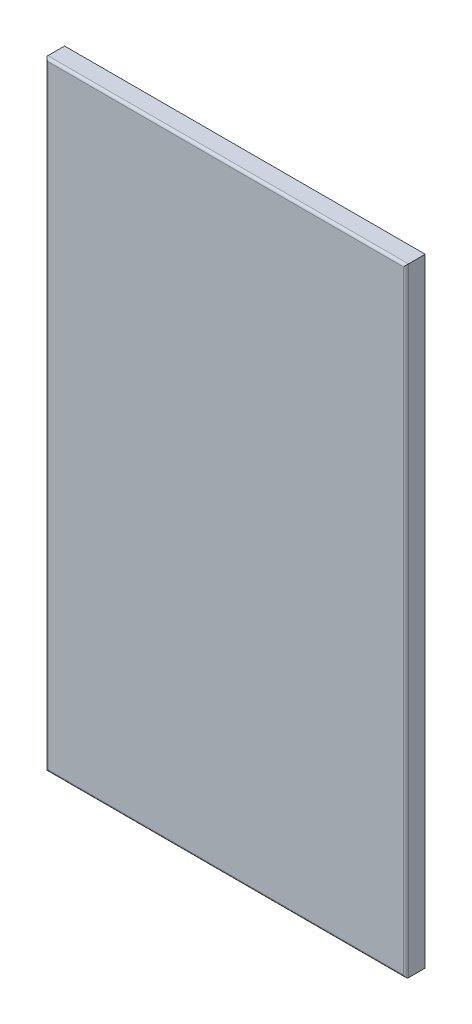
ISO-10303-21;
HEADER;
FILE_DESCRIPTION(('STEP AP214'),'2;1');
FILE_NAME('part.step','',(''),(''),'','','');
FILE_SCHEMA(('AUTOMOTIVE_DESIGN { 1 0 10303 214 1 1 1 1 }'));
ENDSEC;
DATA;
#1=APPLICATION_CONTEXT('core data for automotive mechanical design processes');
#2=APPLICATION_PROTOCOL_DEFINITION('international standard','automotive_design',2000,#1);
#3=PRODUCT_CONTEXT('',#1,'mechanical');
#4=PRODUCT('Part','Part','',(#3));
#5=PRODUCT_RELATED_PRODUCT_CATEGORY('part','',(#4));
#6=PRODUCT_DEFINITION_FORMATION('','',#4);
#7=PRODUCT_DEFINITION_CONTEXT('part definition',#1,'design');
#8=PRODUCT_DEFINITION('design','',#6,#7);
#9=PRODUCT_DEFINITION_SHAPE('','',#8);
#10=(LENGTH_UNIT() NAMED_UNIT(*) SI_UNIT(.MILLI.,.METRE.));
#11=(NAMED_UNIT(*) PLANE_ANGLE_UNIT() SI_UNIT($,.RADIAN.));
#12=(NAMED_UNIT(*) SI_UNIT($,.STERADIAN.) SOLID_ANGLE_UNIT());
#13=UNCERTAINTY_MEASURE_WITH_UNIT(LENGTH_MEASURE(1.E-05),#10,'distance_accuracy_value','');
#14=(GEOMETRIC_REPRESENTATION_CONTEXT(3) GLOBAL_UNCERTAINTY_ASSIGNED_CONTEXT((#13)) GLOBAL_UNIT_ASSIGNED_CONTEXT((#10,
#11,#12)) REPRESENTATION_CONTEXT('',''));
#15=CARTESIAN_POINT('',(0.,0.,0.));
#16=DIRECTION('',(0.,0.,1.));
#17=DIRECTION('',(1.,0.,0.));
#18=AXIS2_PLACEMENT_3D('',#15,#16,#17);
#19=CARTESIAN_POINT('',(-177.8,304.8,2.54));
#20=DIRECTION('',(1.,0.,0.));
#21=DIRECTION('',(0.,1.,0.));
#22=AXIS2_PLACEMENT_3D('',#19,#20,#21);
#23=PLANE('',#22);
#24=DIRECTION('',(0.,0.,-1.));
#25=VECTOR('',#24,1.);
#26=CARTESIAN_POINT('',(-177.8,-304.8,2.54));
#27=LINE('',#26,#25);
#28=CARTESIAN_POINT('',(-177.8,-304.8,0.));
#29=VERTEX_POINT('',#28);
#30=CARTESIAN_POINT('',(-177.8,-304.8,-16.51));
#31=VERTEX_POINT('',#30);
#32=EDGE_CURVE('E167',#29,#31,#27,.T.);
#33=ORIENTED_EDGE('',*,*,#32,.F.);
#34=DIRECTION('',(0.,-1.,0.));
#35=VECTOR('',#34,1.);
#36=CARTESIAN_POINT('',(-177.8,304.8,0.));
#37=LINE('',#36,#35);
#38=CARTESIAN_POINT('',(-177.8,304.8,0.));
#39=VERTEX_POINT('',#38);
#40=EDGE_CURVE('E11',#29,#39,#37,.F.);
#41=ORIENTED_EDGE('',*,*,#40,.T.);
#42=DIRECTION('',(0.,0.,-1.));
#43=VECTOR('',#42,1.);
#44=CARTESIAN_POINT('',(-177.8,304.8,2.54));
#45=LINE('',#44,#43);
#46=CARTESIAN_POINT('',(-177.8,304.8,-16.51));
#47=VERTEX_POINT('',#46);
#48=EDGE_CURVE('E161',#39,#47,#45,.T.);
#49=ORIENTED_EDGE('',*,*,#48,.T.);
#50=DIRECTION('',(0.,-1.,0.));
#51=VECTOR('',#50,1.);
#52=CARTESIAN_POINT('',(-177.8,304.8,-16.51));
#53=LINE('',#52,#51);
#54=EDGE_CURVE('E152',#47,#31,#53,.T.);
#55=ORIENTED_EDGE('',*,*,#54,.T.);
#56=EDGE_LOOP('',(#33,#41,#49,#55));
#57=FACE_BOUND('',#56,.T.);
#58=ADVANCED_FACE('F33',(#57),#23,.F.);
#59=CARTESIAN_POINT('',(177.8,-304.8,2.54));
#60=DIRECTION('',(0.,1.,0.));
#61=DIRECTION('',(0.,0.,1.));
#62=AXIS2_PLACEMENT_3D('',#59,#60,#61);
#63=PLANE('',#62);
#64=DIRECTION('',(0.,0.,-1.));
#65=VECTOR('',#64,1.);
#66=CARTESIAN_POINT('',(177.8,-304.8,2.54));
#67=LINE('',#66,#65);
#68=CARTESIAN_POINT('',(177.8,-304.8,0.));
#69=VERTEX_POINT('',#68);
#70=CARTESIAN_POINT('',(177.8,-304.8,-16.51));
#71=VERTEX_POINT('',#70);
#72=EDGE_CURVE('E165',#69,#71,#67,.T.);
#73=ORIENTED_EDGE('',*,*,#72,.F.);
#74=DIRECTION('',(1.,0.,0.));
#75=VECTOR('',#74,1.);
#76=CARTESIAN_POINT('',(177.8,-304.8,0.));
#77=LINE('',#76,#75);
#78=EDGE_CURVE('E42',#69,#29,#77,.F.);
#79=ORIENTED_EDGE('',*,*,#78,.T.);
#80=ORIENTED_EDGE('',*,*,#32,.T.);
#81=DIRECTION('',(1.,0.,0.));
#82=VECTOR('',#81,1.);
#83=CARTESIAN_POINT('',(-177.8,-304.8,-16.51));
#84=LINE('',#83,#82);
#85=EDGE_CURVE('E155',#31,#71,#84,.T.);
#86=ORIENTED_EDGE('',*,*,#85,.T.);
#87=EDGE_LOOP('',(#73,#79,#80,#86));
#88=FACE_BOUND('',#87,.T.);
#89=ADVANCED_FACE('F222',(#88),#63,.F.);
#90=CARTESIAN_POINT('',(177.8,304.8,2.54));
#91=DIRECTION('',(-1.,0.,0.));
#92=DIRECTION('',(0.,-1.,0.));
#93=AXIS2_PLACEMENT_3D('',#90,#91,#92);
#94=PLANE('',#93);
#95=DIRECTION('',(0.,0.,-1.));
#96=VECTOR('',#95,1.);
#97=CARTESIAN_POINT('',(177.8,304.8,2.54));
#98=LINE('',#97,#96);
#99=CARTESIAN_POINT('',(177.8,304.8,0.));
#100=VERTEX_POINT('',#99);
#101=CARTESIAN_POINT('',(177.8,304.8,-16.51));
#102=VERTEX_POINT('',#101);
#103=EDGE_CURVE('E163',#100,#102,#98,.T.);
#104=ORIENTED_EDGE('',*,*,#103,.F.);
#105=DIRECTION('',(0.,1.,0.));
#106=VECTOR('',#105,1.);
#107=CARTESIAN_POINT('',(177.8,304.8,0.));
#108=LINE('',#107,#106);
#109=EDGE_CURVE('E57',#100,#69,#108,.F.);
#110=ORIENTED_EDGE('',*,*,#109,.T.);
#111=ORIENTED_EDGE('',*,*,#72,.T.);
#112=DIRECTION('',(0.,1.,0.));
#113=VECTOR('',#112,1.);
#114=CARTESIAN_POINT('',(177.8,-304.8,-16.51));
#115=LINE('',#114,#113);
#116=EDGE_CURVE('E158',#71,#102,#115,.T.);
#117=ORIENTED_EDGE('',*,*,#116,.T.);
#118=EDGE_LOOP('',(#104,#110,#111,#117));
#119=FACE_BOUND('',#118,.T.);
#120=ADVANCED_FACE('F217',(#119),#94,.F.);
#121=CARTESIAN_POINT('',(177.8,304.8,2.54));
#122=DIRECTION('',(0.,-1.,0.));
#123=DIRECTION('',(1.,0.,0.));
#124=AXIS2_PLACEMENT_3D('',#121,#122,#123);
#125=PLANE('',#124);
#126=ORIENTED_EDGE('',*,*,#48,.F.);
#127=DIRECTION('',(-1.,0.,0.));
#128=VECTOR('',#127,1.);
#129=CARTESIAN_POINT('',(177.8,304.8,0.));
#130=LINE('',#129,#128);
#131=EDGE_CURVE('E187',#39,#100,#130,.F.);
#132=ORIENTED_EDGE('',*,*,#131,.T.);
#133=ORIENTED_EDGE('',*,*,#103,.T.);
#134=DIRECTION('',(-1.,0.,0.));
#135=VECTOR('',#134,1.);
#136=CARTESIAN_POINT('',(177.8,304.8,-16.51));
#137=LINE('',#136,#135);
#138=EDGE_CURVE('E145',#102,#47,#137,.T.);
#139=ORIENTED_EDGE('',*,*,#138,.T.);
#140=EDGE_LOOP('',(#126,#132,#133,#139));
#141=FACE_BOUND('',#140,.T.);
#142=ADVANCED_FACE('F215',(#141),#125,.F.);
#143=CARTESIAN_POINT('',(0.,0.,2.54));
#144=DIRECTION('',(0.,0.,-1.));
#145=DIRECTION('',(-1.,0.,0.));
#146=AXIS2_PLACEMENT_3D('',#143,#144,#145);
#147=PLANE('',#146);
#148=DIRECTION('',(0.,1.,0.));
#149=VECTOR('',#148,1.);
#150=CARTESIAN_POINT('',(175.26,0.,2.54));
#151=LINE('',#150,#149);
#152=CARTESIAN_POINT('',(175.26,-302.26,2.54));
#153=VERTEX_POINT('',#152);
#154=CARTESIAN_POINT('',(175.26,302.26,2.54));
#155=VERTEX_POINT('',#154);
#156=EDGE_CURVE('E182',#153,#155,#151,.T.);
#157=ORIENTED_EDGE('',*,*,#156,.T.);
#158=DIRECTION('',(-1.,0.,0.));
#159=VECTOR('',#158,1.);
#160=CARTESIAN_POINT('',(0.,302.26,2.54));
#161=LINE('',#160,#159);
#162=CARTESIAN_POINT('',(-175.26,302.26,2.54));
#163=VERTEX_POINT('',#162);
#164=EDGE_CURVE('E184',#155,#163,#161,.T.);
#165=ORIENTED_EDGE('',*,*,#164,.T.);
#166=DIRECTION('',(0.,-1.,0.));
#167=VECTOR('',#166,1.);
#168=CARTESIAN_POINT('',(-175.26,0.,2.54));
#169=LINE('',#168,#167);
#170=CARTESIAN_POINT('',(-175.26,-302.26,2.54));
#171=VERTEX_POINT('',#170);
#172=EDGE_CURVE('E178',#163,#171,#169,.T.);
#173=ORIENTED_EDGE('',*,*,#172,.T.);
#174=DIRECTION('',(1.,0.,0.));
#175=VECTOR('',#174,1.);
#176=CARTESIAN_POINT('',(0.,-302.26,2.54));
#177=LINE('',#176,#175);
#178=EDGE_CURVE('E180',#171,#153,#177,.T.);
#179=ORIENTED_EDGE('',*,*,#178,.T.);
#180=EDGE_LOOP('',(#157,#165,#173,#179));
#181=FACE_BOUND('',#180,.T.);
#182=ADVANCED_FACE('F207',(#181),#147,.F.);
#183=CARTESIAN_POINT('',(0.,0.,-16.51));
#184=DIRECTION('',(0.,0.,1.));
#185=DIRECTION('',(1.,0.,0.));
#186=AXIS2_PLACEMENT_3D('',#183,#184,#185);
#187=PLANE('',#186);
#188=DIRECTION('',(1.,0.,0.));
#189=VECTOR('',#188,1.);
#190=CARTESIAN_POINT('',(-175.26,-302.26,-16.51));
#191=LINE('',#190,#189);
#192=CARTESIAN_POINT('',(-175.26,-302.26,-16.51));
#193=VERTEX_POINT('',#192);
#194=CARTESIAN_POINT('',(175.26,-302.26,-16.51));
#195=VERTEX_POINT('',#194);
#196=EDGE_CURVE('E123',#193,#195,#191,.T.);
#197=ORIENTED_EDGE('',*,*,#196,.T.);
#198=DIRECTION('',(0.,1.,0.));
#199=VECTOR('',#198,1.);
#200=CARTESIAN_POINT('',(175.26,-302.26,-16.51));
#201=LINE('',#200,#199);
#202=CARTESIAN_POINT('',(175.26,302.26,-16.51));
#203=VERTEX_POINT('',#202);
#204=EDGE_CURVE('E116',#195,#203,#201,.T.);
#205=ORIENTED_EDGE('',*,*,#204,.T.);
#206=DIRECTION('',(-1.,0.,0.));
#207=VECTOR('',#206,1.);
#208=CARTESIAN_POINT('',(175.26,302.26,-16.51));
#209=LINE('',#208,#207);
#210=CARTESIAN_POINT('',(-175.26,302.26,-16.51));
#211=VERTEX_POINT('',#210);
#212=EDGE_CURVE('E127',#203,#211,#209,.T.);
#213=ORIENTED_EDGE('',*,*,#212,.T.);
#214=DIRECTION('',(0.,-1.,0.));
#215=VECTOR('',#214,1.);
#216=CARTESIAN_POINT('',(-175.26,302.26,-16.51));
#217=LINE('',#216,#215);
#218=EDGE_CURVE('E132',#211,#193,#217,.T.);
#219=ORIENTED_EDGE('',*,*,#218,.T.);
#220=EDGE_LOOP('',(#197,#205,#213,#219));
#221=FACE_BOUND('',#220,.T.);
#222=ORIENTED_EDGE('',*,*,#138,.F.);
#223=ORIENTED_EDGE('',*,*,#116,.F.);
#224=ORIENTED_EDGE('',*,*,#85,.F.);
#225=ORIENTED_EDGE('',*,*,#54,.F.);
#226=EDGE_LOOP('',(#222,#223,#224,#225));
#227=FACE_BOUND('',#226,.T.);
#228=ADVANCED_FACE('F134',(#221,#227),#187,.F.);
#229=CARTESIAN_POINT('',(175.26,-302.26,-16.51));
#230=DIRECTION('',(1.,0.,0.));
#231=DIRECTION('',(0.,0.,-1.));
#232=AXIS2_PLACEMENT_3D('',#229,#230,#231);
#233=PLANE('',#232);
#234=DIRECTION('',(0.,-1.,0.));
#235=VECTOR('',#234,1.);
#236=CARTESIAN_POINT('',(175.26,0.,0.));
#237=LINE('',#236,#235);
#238=CARTESIAN_POINT('',(175.26,302.26,0.));
#239=VERTEX_POINT('',#238);
#240=CARTESIAN_POINT('',(175.26,-302.26,0.));
#241=VERTEX_POINT('',#240);
#242=EDGE_CURVE('E119',#239,#241,#237,.T.);
#243=ORIENTED_EDGE('',*,*,#242,.F.);
#244=DIRECTION('',(0.,0.,1.));
#245=VECTOR('',#244,1.);
#246=CARTESIAN_POINT('',(175.26,302.26,-16.51));
#247=LINE('',#246,#245);
#248=EDGE_CURVE('E111',#203,#239,#247,.T.);
#249=ORIENTED_EDGE('',*,*,#248,.F.);
#250=ORIENTED_EDGE('',*,*,#204,.F.);
#251=DIRECTION('',(0.,0.,1.));
#252=VECTOR('',#251,1.);
#253=CARTESIAN_POINT('',(175.26,-302.26,-16.51));
#254=LINE('',#253,#252);
#255=EDGE_CURVE('E143',#195,#241,#254,.T.);
#256=ORIENTED_EDGE('',*,*,#255,.T.);
#257=EDGE_LOOP('',(#243,#249,#250,#256));
#258=FACE_BOUND('',#257,.T.);
#259=ADVANCED_FACE('F113',(#258),#233,.F.);
#260=CARTESIAN_POINT('',(-175.26,-302.26,-16.51));
#261=DIRECTION('',(0.,-1.,0.));
#262=DIRECTION('',(0.,0.,-1.));
#263=AXIS2_PLACEMENT_3D('',#260,#261,#262);
#264=PLANE('',#263);
#265=DIRECTION('',(-1.,0.,0.));
#266=VECTOR('',#265,1.);
#267=CARTESIAN_POINT('',(0.,-302.26,0.));
#268=LINE('',#267,#266);
#269=CARTESIAN_POINT('',(-175.26,-302.26,0.));
#270=VERTEX_POINT('',#269);
#271=EDGE_CURVE('E174',#241,#270,#268,.T.);
#272=ORIENTED_EDGE('',*,*,#271,.F.);
#273=ORIENTED_EDGE('',*,*,#255,.F.);
#274=ORIENTED_EDGE('',*,*,#196,.F.);
#275=DIRECTION('',(0.,0.,1.));
#276=VECTOR('',#275,1.);
#277=CARTESIAN_POINT('',(-175.26,-302.26,-16.51));
#278=LINE('',#277,#276);
#279=EDGE_CURVE('E146',#193,#270,#278,.T.);
#280=ORIENTED_EDGE('',*,*,#279,.T.);
#281=EDGE_LOOP('',(#272,#273,#274,#280));
#282=FACE_BOUND('',#281,.T.);
#283=ADVANCED_FACE('F265',(#282),#264,.F.);
#284=CARTESIAN_POINT('',(-175.26,302.26,-16.51));
#285=DIRECTION('',(-1.,0.,0.));
#286=DIRECTION('',(0.,0.,1.));
#287=AXIS2_PLACEMENT_3D('',#284,#285,#286);
#288=PLANE('',#287);
#289=DIRECTION('',(0.,1.,0.));
#290=VECTOR('',#289,1.);
#291=CARTESIAN_POINT('',(-175.26,0.,0.));
#292=LINE('',#291,#290);
#293=CARTESIAN_POINT('',(-175.26,302.26,0.));
#294=VERTEX_POINT('',#293);
#295=EDGE_CURVE('E171',#270,#294,#292,.T.);
#296=ORIENTED_EDGE('',*,*,#295,.F.);
#297=ORIENTED_EDGE('',*,*,#279,.F.);
#298=ORIENTED_EDGE('',*,*,#218,.F.);
#299=DIRECTION('',(0.,0.,1.));
#300=VECTOR('',#299,1.);
#301=CARTESIAN_POINT('',(-175.26,302.26,-16.51));
#302=LINE('',#301,#300);
#303=EDGE_CURVE('E122',#211,#294,#302,.T.);
#304=ORIENTED_EDGE('',*,*,#303,.T.);
#305=EDGE_LOOP('',(#296,#297,#298,#304));
#306=FACE_BOUND('',#305,.T.);
#307=ADVANCED_FACE('F251',(#306),#288,.F.);
#308=CARTESIAN_POINT('',(175.26,302.26,-16.51));
#309=DIRECTION('',(0.,1.,0.));
#310=DIRECTION('',(0.,0.,1.));
#311=AXIS2_PLACEMENT_3D('',#308,#309,#310);
#312=PLANE('',#311);
#313=DIRECTION('',(1.,0.,0.));
#314=VECTOR('',#313,1.);
#315=CARTESIAN_POINT('',(0.,302.26,0.));
#316=LINE('',#315,#314);
#317=EDGE_CURVE('E169',#294,#239,#316,.T.);
#318=ORIENTED_EDGE('',*,*,#317,.F.);
#319=ORIENTED_EDGE('',*,*,#303,.F.);
#320=ORIENTED_EDGE('',*,*,#212,.F.);
#321=ORIENTED_EDGE('',*,*,#248,.T.);
#322=EDGE_LOOP('',(#318,#319,#320,#321));
#323=FACE_BOUND('',#322,.T.);
#324=ADVANCED_FACE('F128',(#323),#312,.F.);
#325=CARTESIAN_POINT('',(0.,0.,0.));
#326=DIRECTION('',(0.,0.,-1.));
#327=DIRECTION('',(-1.,0.,0.));
#328=AXIS2_PLACEMENT_3D('',#325,#326,#327);
#329=PLANE('',#328);
#330=ORIENTED_EDGE('',*,*,#317,.T.);
#331=ORIENTED_EDGE('',*,*,#242,.T.);
#332=ORIENTED_EDGE('',*,*,#271,.T.);
#333=ORIENTED_EDGE('',*,*,#295,.T.);
#334=EDGE_LOOP('',(#330,#331,#332,#333));
#335=FACE_BOUND('',#334,.T.);
#336=ADVANCED_FACE('F242',(#335),#329,.T.);
#337=CARTESIAN_POINT('',(0.,-302.26,0.));
#338=DIRECTION('',(1.,0.,0.));
#339=DIRECTION('',(0.,0.,-1.));
#340=AXIS2_PLACEMENT_3D('',#337,#338,#339);
#341=CYLINDRICAL_SURFACE('',#340,2.54);
#342=CARTESIAN_POINT('',(-175.26,-302.26,0.));
#343=DIRECTION('',(0.707106781186548,-0.707106781186547,0.));
#344=DIRECTION('',(-0.707106781186547,-0.707106781186548,0.));
#345=AXIS2_PLACEMENT_3D('',#342,#343,#344);
#346=ELLIPSE('',#345,3.59210244842766,2.54);
#347=EDGE_CURVE('E139',#29,#171,#346,.F.);
#348=ORIENTED_EDGE('',*,*,#347,.F.);
#349=ORIENTED_EDGE('',*,*,#78,.F.);
#350=CARTESIAN_POINT('',(175.26,-302.26,0.));
#351=DIRECTION('',(0.707106781186547,0.707106781186548,0.));
#352=DIRECTION('',(0.707106781186547,-0.707106781186547,0.));
#353=AXIS2_PLACEMENT_3D('',#350,#351,#352);
#354=ELLIPSE('',#353,3.59210244842766,2.54);
#355=EDGE_CURVE('E37',#153,#69,#354,.T.);
#356=ORIENTED_EDGE('',*,*,#355,.F.);
#357=ORIENTED_EDGE('',*,*,#178,.F.);
#358=EDGE_LOOP('',(#348,#349,#356,#357));
#359=FACE_BOUND('',#358,.T.);
#360=ADVANCED_FACE('F35',(#359),#341,.T.);
#361=CARTESIAN_POINT('',(175.26,0.,0.));
#362=DIRECTION('',(0.,1.,0.));
#363=DIRECTION('',(-1.,0.,0.));
#364=AXIS2_PLACEMENT_3D('',#361,#362,#363);
#365=CYLINDRICAL_SURFACE('',#364,2.54);
#366=ORIENTED_EDGE('',*,*,#355,.T.);
#367=ORIENTED_EDGE('',*,*,#109,.F.);
#368=CARTESIAN_POINT('',(175.26,302.26,0.));
#369=DIRECTION('',(-0.707106781186548,0.707106781186547,0.));
#370=DIRECTION('',(0.707106781186547,0.707106781186548,0.));
#371=AXIS2_PLACEMENT_3D('',#368,#369,#370);
#372=ELLIPSE('',#371,3.59210244842766,2.54);
#373=EDGE_CURVE('E194',#155,#100,#372,.T.);
#374=ORIENTED_EDGE('',*,*,#373,.F.);
#375=ORIENTED_EDGE('',*,*,#156,.F.);
#376=EDGE_LOOP('',(#366,#367,#374,#375));
#377=FACE_BOUND('',#376,.T.);
#378=ADVANCED_FACE('F236',(#377),#365,.T.);
#379=CARTESIAN_POINT('',(-175.26,0.,0.));
#380=DIRECTION('',(0.,-1.,0.));
#381=DIRECTION('',(1.,0.,0.));
#382=AXIS2_PLACEMENT_3D('',#379,#380,#381);
#383=CYLINDRICAL_SURFACE('',#382,2.54);
#384=ORIENTED_EDGE('',*,*,#347,.T.);
#385=ORIENTED_EDGE('',*,*,#172,.F.);
#386=CARTESIAN_POINT('',(-175.26,302.26,0.));
#387=DIRECTION('',(-0.707106781186547,-0.707106781186548,0.));
#388=DIRECTION('',(0.707106781186548,-0.707106781186547,0.));
#389=AXIS2_PLACEMENT_3D('',#386,#387,#388);
#390=ELLIPSE('',#389,3.59210244842766,2.54);
#391=EDGE_CURVE('E192',#39,#163,#390,.F.);
#392=ORIENTED_EDGE('',*,*,#391,.F.);
#393=ORIENTED_EDGE('',*,*,#40,.F.);
#394=EDGE_LOOP('',(#384,#385,#392,#393));
#395=FACE_BOUND('',#394,.T.);
#396=ADVANCED_FACE('F200',(#395),#383,.T.);
#397=CARTESIAN_POINT('',(0.,302.26,0.));
#398=DIRECTION('',(-1.,0.,0.));
#399=DIRECTION('',(0.,-1.,0.));
#400=AXIS2_PLACEMENT_3D('',#397,#398,#399);
#401=CYLINDRICAL_SURFACE('',#400,2.54);
#402=ORIENTED_EDGE('',*,*,#373,.T.);
#403=ORIENTED_EDGE('',*,*,#131,.F.);
#404=ORIENTED_EDGE('',*,*,#391,.T.);
#405=ORIENTED_EDGE('',*,*,#164,.F.);
#406=EDGE_LOOP('',(#402,#403,#404,#405));
#407=FACE_BOUND('',#406,.T.);
#408=ADVANCED_FACE('F211',(#407),#401,.T.);
#409=CLOSED_SHELL('',(#58,#89,#120,#142,#182,#228,#259,#283,#307,#324,#336,#360,#378,#396,#408));
#410=MANIFOLD_SOLID_BREP('B2',#409);
#411=ADVANCED_BREP_SHAPE_REPRESENTATION('',(#18,#410),#14);
#412=SHAPE_DEFINITION_REPRESENTATION(#9,#411);
ENDSEC;
END-ISO-10303-21;
